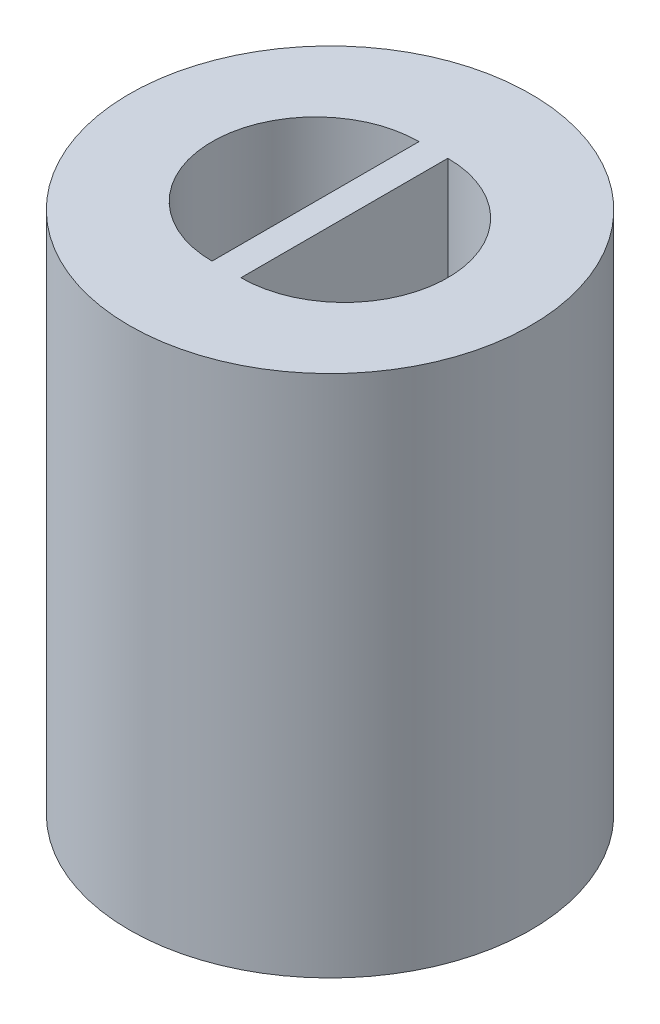
ISO-10303-21;
HEADER;
FILE_DESCRIPTION(('STEP AP214'),'2;1');
FILE_NAME('part.step','',(''),(''),'','','');
FILE_SCHEMA(('AUTOMOTIVE_DESIGN { 1 0 10303 214 1 1 1 1 }'));
ENDSEC;
DATA;
#1=APPLICATION_CONTEXT('core data for automotive mechanical design processes');
#2=APPLICATION_PROTOCOL_DEFINITION('international standard','automotive_design',2000,#1);
#3=PRODUCT_CONTEXT('',#1,'mechanical');
#4=PRODUCT('Part','Part','',(#3));
#5=PRODUCT_RELATED_PRODUCT_CATEGORY('part','',(#4));
#6=PRODUCT_DEFINITION_FORMATION('','',#4);
#7=PRODUCT_DEFINITION_CONTEXT('part definition',#1,'design');
#8=PRODUCT_DEFINITION('design','',#6,#7);
#9=PRODUCT_DEFINITION_SHAPE('','',#8);
#10=(LENGTH_UNIT() NAMED_UNIT(*) SI_UNIT(.MILLI.,.METRE.));
#11=(NAMED_UNIT(*) PLANE_ANGLE_UNIT() SI_UNIT($,.RADIAN.));
#12=(NAMED_UNIT(*) SI_UNIT($,.STERADIAN.) SOLID_ANGLE_UNIT());
#13=UNCERTAINTY_MEASURE_WITH_UNIT(LENGTH_MEASURE(1.E-05),#10,'distance_accuracy_value','');
#14=(GEOMETRIC_REPRESENTATION_CONTEXT(3) GLOBAL_UNCERTAINTY_ASSIGNED_CONTEXT((#13)) GLOBAL_UNIT_ASSIGNED_CONTEXT((#10,
#11,#12)) REPRESENTATION_CONTEXT('',''));
#15=CARTESIAN_POINT('',(0.,0.,0.));
#16=DIRECTION('',(0.,0.,1.));
#17=DIRECTION('',(1.,0.,0.));
#18=AXIS2_PLACEMENT_3D('',#15,#16,#17);
#19=CARTESIAN_POINT('',(0.,15.,0.));
#20=DIRECTION('',(0.,-1.,0.));
#21=DIRECTION('',(0.,0.,-1.));
#22=AXIS2_PLACEMENT_3D('',#19,#20,#21);
#23=CYLINDRICAL_SURFACE('',#22,5.75);
#24=CARTESIAN_POINT('',(0.,15.,0.));
#25=DIRECTION('',(0.,1.,0.));
#26=DIRECTION('',(0.,0.,1.));
#27=AXIS2_PLACEMENT_3D('',#24,#25,#26);
#28=CIRCLE('',#27,5.75);
#29=CARTESIAN_POINT('',(0.,15.,5.75));
#30=VERTEX_POINT('',#29);
#31=EDGE_CURVE('E11',#30,#30,#28,.T.);
#32=ORIENTED_EDGE('',*,*,#31,.F.);
#33=EDGE_LOOP('',(#32));
#34=FACE_BOUND('',#33,.T.);
#35=CARTESIAN_POINT('',(0.,0.,0.));
#36=DIRECTION('',(0.,1.,0.));
#37=DIRECTION('',(0.,0.,1.));
#38=AXIS2_PLACEMENT_3D('',#35,#36,#37);
#39=CIRCLE('',#38,5.75);
#40=CARTESIAN_POINT('',(0.,0.,5.75));
#41=VERTEX_POINT('',#40);
#42=EDGE_CURVE('E42',#41,#41,#39,.T.);
#43=ORIENTED_EDGE('',*,*,#42,.T.);
#44=EDGE_LOOP('',(#43));
#45=FACE_BOUND('',#44,.T.);
#46=ADVANCED_FACE('F39',(#34,#45),#23,.T.);
#47=CARTESIAN_POINT('',(0.,15.,0.));
#48=DIRECTION('',(0.,1.,0.));
#49=DIRECTION('',(0.,0.,1.));
#50=AXIS2_PLACEMENT_3D('',#47,#48,#49);
#51=PLANE('',#50);
#52=CARTESIAN_POINT('',(0.41,15.,0.));
#53=DIRECTION('',(0.,1.,0.));
#54=DIRECTION('',(0.,0.,-1.));
#55=AXIS2_PLACEMENT_3D('',#52,#53,#54);
#56=CIRCLE('',#55,2.96467159946198);
#57=CARTESIAN_POINT('',(0.41,15.,2.96467159946198));
#58=VERTEX_POINT('',#57);
#59=CARTESIAN_POINT('',(0.41,15.,-2.96467159946198));
#60=VERTEX_POINT('',#59);
#61=EDGE_CURVE('E54',#58,#60,#56,.T.);
#62=ORIENTED_EDGE('',*,*,#61,.F.);
#63=DIRECTION('',(0.,0.,1.));
#64=VECTOR('',#63,1.);
#65=CARTESIAN_POINT('',(0.41,15.,-2.96467159946198));
#66=LINE('',#65,#64);
#67=EDGE_CURVE('E94',#60,#58,#66,.T.);
#68=ORIENTED_EDGE('',*,*,#67,.F.);
#69=EDGE_LOOP('',(#62,#68));
#70=FACE_BOUND('',#69,.T.);
#71=CARTESIAN_POINT('',(-0.416408681207295,15.,0.));
#72=DIRECTION('',(0.,1.,0.));
#73=DIRECTION('',(0.,0.,1.));
#74=AXIS2_PLACEMENT_3D('',#71,#72,#73);
#75=CIRCLE('',#74,2.96556468188459);
#76=CARTESIAN_POINT('',(-0.416408681207295,15.,-2.96556468188459));
#77=VERTEX_POINT('',#76);
#78=CARTESIAN_POINT('',(-0.416408681207294,15.,2.96556468188459));
#79=VERTEX_POINT('',#78);
#80=EDGE_CURVE('E62',#77,#79,#75,.T.);
#81=ORIENTED_EDGE('',*,*,#80,.F.);
#82=DIRECTION('',(0.,0.,-1.));
#83=VECTOR('',#82,1.);
#84=CARTESIAN_POINT('',(-0.416408681207295,15.,-2.96556468188459));
#85=LINE('',#84,#83);
#86=EDGE_CURVE('E113',#79,#77,#85,.T.);
#87=ORIENTED_EDGE('',*,*,#86,.F.);
#88=EDGE_LOOP('',(#81,#87));
#89=FACE_BOUND('',#88,.T.);
#90=ORIENTED_EDGE('',*,*,#31,.T.);
#91=EDGE_LOOP('',(#90));
#92=FACE_BOUND('',#91,.T.);
#93=ADVANCED_FACE('F133',(#70,#89,#92),#51,.T.);
#94=CARTESIAN_POINT('',(0.,0.,0.));
#95=DIRECTION('',(0.,1.,0.));
#96=DIRECTION('',(0.,0.,1.));
#97=AXIS2_PLACEMENT_3D('',#94,#95,#96);
#98=PLANE('',#97);
#99=CARTESIAN_POINT('',(0.,0.,0.));
#100=DIRECTION('',(0.,1.,0.));
#101=DIRECTION('',(0.,0.,1.));
#102=AXIS2_PLACEMENT_3D('',#99,#100,#101);
#103=CIRCLE('',#102,1.);
#104=CARTESIAN_POINT('',(0.,0.,-1.));
#105=VERTEX_POINT('',#104);
#106=EDGE_CURVE('E180',#105,#105,#103,.T.);
#107=ORIENTED_EDGE('',*,*,#106,.T.);
#108=EDGE_LOOP('',(#107));
#109=FACE_BOUND('',#108,.T.);
#110=ORIENTED_EDGE('',*,*,#42,.F.);
#111=EDGE_LOOP('',(#110));
#112=FACE_BOUND('',#111,.T.);
#113=ADVANCED_FACE('F136',(#109,#112),#98,.F.);
#114=CARTESIAN_POINT('',(-0.416408681207295,7.,0.));
#115=DIRECTION('',(0.,1.,0.));
#116=DIRECTION('',(0.,0.,1.));
#117=AXIS2_PLACEMENT_3D('',#114,#115,#116);
#118=CYLINDRICAL_SURFACE('',#117,2.96556468188459);
#119=ORIENTED_EDGE('',*,*,#80,.T.);
#120=DIRECTION('',(0.,1.,0.));
#121=VECTOR('',#120,1.);
#122=CARTESIAN_POINT('',(-0.416408681207294,7.,2.96556468188459));
#123=LINE('',#122,#121);
#124=CARTESIAN_POINT('',(-0.416408681207294,7.,2.96556468188459));
#125=VERTEX_POINT('',#124);
#126=EDGE_CURVE('E117',#125,#79,#123,.T.);
#127=ORIENTED_EDGE('',*,*,#126,.F.);
#128=CARTESIAN_POINT('',(-0.416408681207295,7.,0.));
#129=DIRECTION('',(0.,1.,0.));
#130=DIRECTION('',(0.,0.,1.));
#131=AXIS2_PLACEMENT_3D('',#128,#129,#130);
#132=CIRCLE('',#131,2.96556468188459);
#133=CARTESIAN_POINT('',(-0.416408681207295,7.,-2.96556468188459));
#134=VERTEX_POINT('',#133);
#135=EDGE_CURVE('E108',#134,#125,#132,.T.);
#136=ORIENTED_EDGE('',*,*,#135,.F.);
#137=DIRECTION('',(0.,1.,0.));
#138=VECTOR('',#137,1.);
#139=CARTESIAN_POINT('',(-0.416408681207295,7.,-2.96556468188459));
#140=LINE('',#139,#138);
#141=EDGE_CURVE('E103',#134,#77,#140,.T.);
#142=ORIENTED_EDGE('',*,*,#141,.T.);
#143=EDGE_LOOP('',(#119,#127,#136,#142));
#144=FACE_BOUND('',#143,.T.);
#145=ADVANCED_FACE('F148',(#144),#118,.F.);
#146=CARTESIAN_POINT('',(-0.416408681207295,7.,-2.96556468188459));
#147=DIRECTION('',(1.,0.,0.));
#148=DIRECTION('',(0.,0.,-1.));
#149=AXIS2_PLACEMENT_3D('',#146,#147,#148);
#150=PLANE('',#149);
#151=ORIENTED_EDGE('',*,*,#86,.T.);
#152=ORIENTED_EDGE('',*,*,#141,.F.);
#153=DIRECTION('',(0.,0.,-1.));
#154=VECTOR('',#153,1.);
#155=CARTESIAN_POINT('',(-0.416408681207295,7.,-2.96556468188459));
#156=LINE('',#155,#154);
#157=EDGE_CURVE('E112',#125,#134,#156,.T.);
#158=ORIENTED_EDGE('',*,*,#157,.F.);
#159=ORIENTED_EDGE('',*,*,#126,.T.);
#160=EDGE_LOOP('',(#151,#152,#158,#159));
#161=FACE_BOUND('',#160,.T.);
#162=ADVANCED_FACE('F130',(#161),#150,.F.);
#163=CARTESIAN_POINT('',(-0.416408681207295,7.,0.));
#164=DIRECTION('',(0.,1.,0.));
#165=DIRECTION('',(0.,0.,1.));
#166=AXIS2_PLACEMENT_3D('',#163,#164,#165);
#167=PLANE('',#166);
#168=ORIENTED_EDGE('',*,*,#135,.T.);
#169=ORIENTED_EDGE('',*,*,#157,.T.);
#170=EDGE_LOOP('',(#168,#169));
#171=FACE_BOUND('',#170,.T.);
#172=ADVANCED_FACE('F158',(#171),#167,.T.);
#173=CARTESIAN_POINT('',(0.41,7.,0.));
#174=DIRECTION('',(0.,1.,0.));
#175=DIRECTION('',(0.,0.,1.));
#176=AXIS2_PLACEMENT_3D('',#173,#174,#175);
#177=CYLINDRICAL_SURFACE('',#176,2.96467159946198);
#178=ORIENTED_EDGE('',*,*,#61,.T.);
#179=DIRECTION('',(0.,1.,0.));
#180=VECTOR('',#179,1.);
#181=CARTESIAN_POINT('',(0.41,7.,-2.96467159946198));
#182=LINE('',#181,#180);
#183=CARTESIAN_POINT('',(0.41,7.,-2.96467159946198));
#184=VERTEX_POINT('',#183);
#185=EDGE_CURVE('E78',#184,#60,#182,.T.);
#186=ORIENTED_EDGE('',*,*,#185,.F.);
#187=CARTESIAN_POINT('',(0.41,7.,0.));
#188=DIRECTION('',(0.,1.,0.));
#189=DIRECTION('',(0.,0.,-1.));
#190=AXIS2_PLACEMENT_3D('',#187,#188,#189);
#191=CIRCLE('',#190,2.96467159946198);
#192=CARTESIAN_POINT('',(0.41,7.,2.96467159946198));
#193=VERTEX_POINT('',#192);
#194=EDGE_CURVE('E81',#193,#184,#191,.T.);
#195=ORIENTED_EDGE('',*,*,#194,.F.);
#196=DIRECTION('',(0.,1.,0.));
#197=VECTOR('',#196,1.);
#198=CARTESIAN_POINT('',(0.41,7.,2.96467159946198));
#199=LINE('',#198,#197);
#200=EDGE_CURVE('E88',#193,#58,#199,.T.);
#201=ORIENTED_EDGE('',*,*,#200,.T.);
#202=EDGE_LOOP('',(#178,#186,#195,#201));
#203=FACE_BOUND('',#202,.T.);
#204=ADVANCED_FACE('F80',(#203),#177,.F.);
#205=CARTESIAN_POINT('',(0.41,7.,-2.96467159946198));
#206=DIRECTION('',(-1.,0.,0.));
#207=DIRECTION('',(0.,0.,1.));
#208=AXIS2_PLACEMENT_3D('',#205,#206,#207);
#209=PLANE('',#208);
#210=ORIENTED_EDGE('',*,*,#67,.T.);
#211=ORIENTED_EDGE('',*,*,#200,.F.);
#212=DIRECTION('',(0.,0.,1.));
#213=VECTOR('',#212,1.);
#214=CARTESIAN_POINT('',(0.41,7.,-2.96467159946198));
#215=LINE('',#214,#213);
#216=EDGE_CURVE('E89',#184,#193,#215,.T.);
#217=ORIENTED_EDGE('',*,*,#216,.F.);
#218=ORIENTED_EDGE('',*,*,#185,.T.);
#219=EDGE_LOOP('',(#210,#211,#217,#218));
#220=FACE_BOUND('',#219,.T.);
#221=ADVANCED_FACE('F96',(#220),#209,.F.);
#222=CARTESIAN_POINT('',(0.41,7.,0.));
#223=DIRECTION('',(0.,-1.,0.));
#224=DIRECTION('',(0.,0.,-1.));
#225=AXIS2_PLACEMENT_3D('',#222,#223,#224);
#226=PLANE('',#225);
#227=ORIENTED_EDGE('',*,*,#194,.T.);
#228=ORIENTED_EDGE('',*,*,#216,.T.);
#229=EDGE_LOOP('',(#227,#228));
#230=FACE_BOUND('',#229,.T.);
#231=ADVANCED_FACE('F92',(#230),#226,.F.);
#232=CARTESIAN_POINT('',(0.,6.5,0.));
#233=DIRECTION('',(0.,-1.,0.));
#234=DIRECTION('',(0.,0.,-1.));
#235=AXIS2_PLACEMENT_3D('',#232,#233,#234);
#236=CYLINDRICAL_SURFACE('',#235,1.);
#237=CARTESIAN_POINT('',(0.,6.5,0.));
#238=DIRECTION('',(0.,1.,0.));
#239=DIRECTION('',(0.,0.,1.));
#240=AXIS2_PLACEMENT_3D('',#237,#238,#239);
#241=CIRCLE('',#240,1.);
#242=CARTESIAN_POINT('',(0.,6.5,-1.));
#243=VERTEX_POINT('',#242);
#244=EDGE_CURVE('E120',#243,#243,#241,.T.);
#245=CARTESIAN_POINT('',(0.,6.5,-1.));
#246=CARTESIAN_POINT('',(0.,6.43229166666667,-1.));
#247=CARTESIAN_POINT('',(0.,6.36458333333333,-1.));
#248=CARTESIAN_POINT('',(0.,6.22916666666667,-1.));
#249=CARTESIAN_POINT('',(0.,6.16145833333333,-1.));
#250=CARTESIAN_POINT('',(0.,6.02604166666667,-1.));
#251=CARTESIAN_POINT('',(0.,5.95833333333333,-1.));
#252=CARTESIAN_POINT('',(0.,5.82291666666667,-1.));
#253=CARTESIAN_POINT('',(0.,5.75520833333333,-1.));
#254=CARTESIAN_POINT('',(0.,5.61979166666667,-1.));
#255=CARTESIAN_POINT('',(0.,5.55208333333333,-1.));
#256=CARTESIAN_POINT('',(0.,5.41666666666667,-1.));
#257=CARTESIAN_POINT('',(0.,5.34895833333333,-1.));
#258=CARTESIAN_POINT('',(0.,5.21354166666667,-1.));
#259=CARTESIAN_POINT('',(0.,5.14583333333333,-1.));
#260=CARTESIAN_POINT('',(0.,5.01041666666667,-1.));
#261=CARTESIAN_POINT('',(0.,4.94270833333333,-1.));
#262=CARTESIAN_POINT('',(0.,4.80729166666667,-1.));
#263=CARTESIAN_POINT('',(0.,4.73958333333333,-1.));
#264=CARTESIAN_POINT('',(0.,4.60416666666667,-1.));
#265=CARTESIAN_POINT('',(0.,4.53645833333333,-1.));
#266=CARTESIAN_POINT('',(0.,4.40104166666667,-1.));
#267=CARTESIAN_POINT('',(0.,4.33333333333333,-1.));
#268=CARTESIAN_POINT('',(0.,4.19791666666667,-1.));
#269=CARTESIAN_POINT('',(0.,4.13020833333333,-1.));
#270=CARTESIAN_POINT('',(0.,3.99479166666667,-1.));
#271=CARTESIAN_POINT('',(0.,3.92708333333333,-1.));
#272=CARTESIAN_POINT('',(0.,3.79166666666667,-1.));
#273=CARTESIAN_POINT('',(0.,3.72395833333333,-1.));
#274=CARTESIAN_POINT('',(0.,3.58854166666667,-1.));
#275=CARTESIAN_POINT('',(0.,3.52083333333333,-1.));
#276=CARTESIAN_POINT('',(0.,3.38541666666667,-1.));
#277=CARTESIAN_POINT('',(0.,3.31770833333333,-1.));
#278=CARTESIAN_POINT('',(0.,3.18229166666667,-1.));
#279=CARTESIAN_POINT('',(0.,3.11458333333333,-1.));
#280=CARTESIAN_POINT('',(0.,2.97916666666667,-1.));
#281=CARTESIAN_POINT('',(0.,2.91145833333333,-1.));
#282=CARTESIAN_POINT('',(0.,2.77604166666667,-1.));
#283=CARTESIAN_POINT('',(0.,2.70833333333333,-1.));
#284=CARTESIAN_POINT('',(0.,2.57291666666667,-1.));
#285=CARTESIAN_POINT('',(0.,2.50520833333333,-1.));
#286=CARTESIAN_POINT('',(0.,2.36979166666667,-1.));
#287=CARTESIAN_POINT('',(0.,2.30208333333333,-1.));
#288=CARTESIAN_POINT('',(0.,2.16666666666667,-1.));
#289=CARTESIAN_POINT('',(0.,2.09895833333333,-1.));
#290=CARTESIAN_POINT('',(0.,1.96354166666667,-1.));
#291=CARTESIAN_POINT('',(0.,1.89583333333333,-1.));
#292=CARTESIAN_POINT('',(0.,1.76041666666667,-1.));
#293=CARTESIAN_POINT('',(0.,1.69270833333333,-1.));
#294=CARTESIAN_POINT('',(0.,1.55729166666667,-1.));
#295=CARTESIAN_POINT('',(0.,1.48958333333333,-1.));
#296=CARTESIAN_POINT('',(0.,1.35416666666667,-1.));
#297=CARTESIAN_POINT('',(0.,1.28645833333333,-1.));
#298=CARTESIAN_POINT('',(0.,1.15104166666667,-1.));
#299=CARTESIAN_POINT('',(0.,1.08333333333333,-1.));
#300=CARTESIAN_POINT('',(0.,0.947916666666667,-1.));
#301=CARTESIAN_POINT('',(0.,0.880208333333333,-1.));
#302=CARTESIAN_POINT('',(0.,0.744791666666667,-1.));
#303=CARTESIAN_POINT('',(0.,0.677083333333333,-1.));
#304=CARTESIAN_POINT('',(0.,0.541666666666667,-1.));
#305=CARTESIAN_POINT('',(0.,0.473958333333333,-1.));
#306=CARTESIAN_POINT('',(0.,0.338541666666667,-1.));
#307=CARTESIAN_POINT('',(0.,0.270833333333334,-1.));
#308=CARTESIAN_POINT('',(0.,0.135416666666667,-1.));
#309=CARTESIAN_POINT('',(0.,0.0677083333333334,-1.));
#310=CARTESIAN_POINT('',(0.,0.,-1.));
#311=B_SPLINE_CURVE_WITH_KNOTS('',3,(#245,#246,#247,#248,#249,#250,#251,#252,#253,#254,#255,
#256,#257,#258,#259,#260,#261,#262,#263,#264,#265,#266,#267,#268,#269,#270,#271,#272,#273,#274,
#275,#276,#277,#278,#279,#280,#281,#282,#283,#284,#285,#286,#287,#288,#289,#290,#291,#292,#293,
#294,#295,#296,#297,#298,#299,#300,#301,#302,#303,#304,#305,#306,#307,#308,#309,#310),
.UNSPECIFIED.,.F.,.F.,(4,2,2,2,2,2,2,2,2,2,2,2,2,2,2,2,2,2,2,2,2,2,2,2,2,2,2,2,2,2,2,2,4),(0.,
0.203125,0.40625,0.609375000000001,0.812500000000001,1.015625,1.21875,1.421875,1.625,1.828125,
2.03125,2.234375,2.4375,2.640625,2.84375,3.046875,3.25,3.453125,3.65625,3.859375,4.0625,
4.265625,4.46875,4.671875,4.875,5.078125,5.28125,5.484375,5.6875,5.890625,6.09375,6.296875,6.5),.UNSPECIFIED.);
#312=EDGE_CURVE('BSEAM168',#243,#105,#311,.T.);
#313=ORIENTED_EDGE('',*,*,#244,.T.);
#314=ORIENTED_EDGE('',*,*,#106,.F.);
#315=ORIENTED_EDGE('',*,*,#312,.T.);
#316=ORIENTED_EDGE('',*,*,#312,.F.);
#317=EDGE_LOOP('',(#313,#315,#314,#316));
#318=FACE_BOUND('',#317,.T.);
#319=ADVANCED_FACE('F168',(#318),#236,.F.);
#320=CARTESIAN_POINT('',(0.,6.5,0.));
#321=DIRECTION('',(0.,1.,0.));
#322=DIRECTION('',(0.,0.,1.));
#323=AXIS2_PLACEMENT_3D('',#320,#321,#322);
#324=PLANE('',#323);
#325=ORIENTED_EDGE('',*,*,#244,.F.);
#326=EDGE_LOOP('',(#325));
#327=FACE_BOUND('',#326,.T.);
#328=ADVANCED_FACE('F171',(#327),#324,.F.);
#329=CLOSED_SHELL('',(#46,#93,#113,#145,#162,#172,#204,#221,#231,#319,#328));
#330=MANIFOLD_SOLID_BREP('B2',#329);
#331=ADVANCED_BREP_SHAPE_REPRESENTATION('',(#18,#330),#14);
#332=SHAPE_DEFINITION_REPRESENTATION(#9,#331);
ENDSEC;
END-ISO-10303-21;
